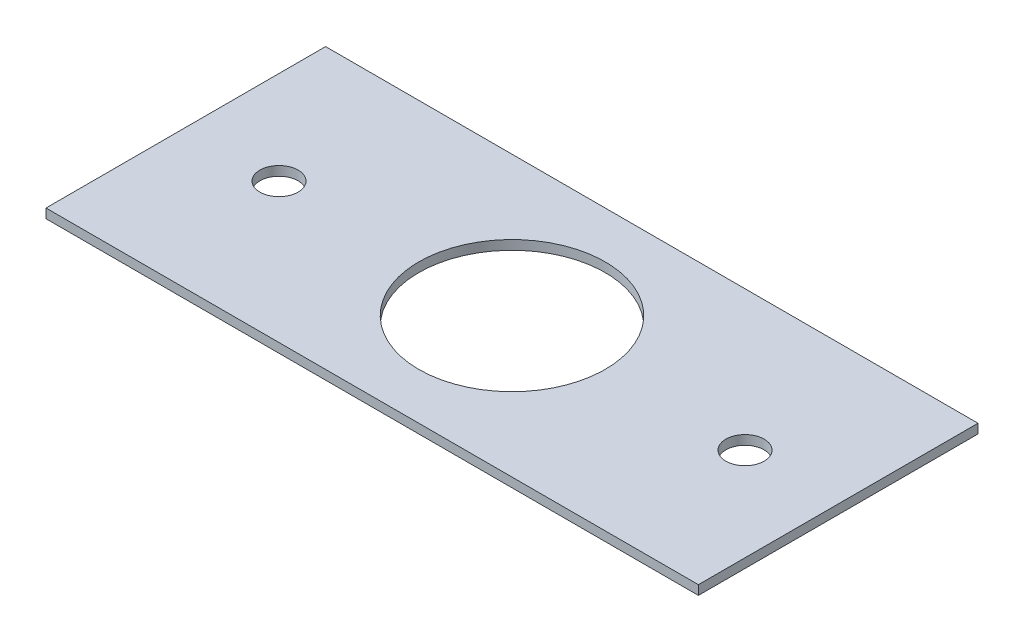
ISO-10303-21;
HEADER;
FILE_DESCRIPTION(('STEP AP214'),'2;1');
FILE_NAME('part.step','',(''),(''),'','','');
FILE_SCHEMA(('AUTOMOTIVE_DESIGN { 1 0 10303 214 1 1 1 1 }'));
ENDSEC;
DATA;
#1=APPLICATION_CONTEXT('core data for automotive mechanical design processes');
#2=APPLICATION_PROTOCOL_DEFINITION('international standard','automotive_design',2000,#1);
#3=PRODUCT_CONTEXT('',#1,'mechanical');
#4=PRODUCT('Part','Part','',(#3));
#5=PRODUCT_RELATED_PRODUCT_CATEGORY('part','',(#4));
#6=PRODUCT_DEFINITION_FORMATION('','',#4);
#7=PRODUCT_DEFINITION_CONTEXT('part definition',#1,'design');
#8=PRODUCT_DEFINITION('design','',#6,#7);
#9=PRODUCT_DEFINITION_SHAPE('','',#8);
#10=(LENGTH_UNIT() NAMED_UNIT(*) SI_UNIT(.MILLI.,.METRE.));
#11=(NAMED_UNIT(*) PLANE_ANGLE_UNIT() SI_UNIT($,.RADIAN.));
#12=(NAMED_UNIT(*) SI_UNIT($,.STERADIAN.) SOLID_ANGLE_UNIT());
#13=UNCERTAINTY_MEASURE_WITH_UNIT(LENGTH_MEASURE(1.E-05),#10,'distance_accuracy_value','');
#14=(GEOMETRIC_REPRESENTATION_CONTEXT(3) GLOBAL_UNCERTAINTY_ASSIGNED_CONTEXT((#13)) GLOBAL_UNIT_ASSIGNED_CONTEXT((#10,
#11,#12)) REPRESENTATION_CONTEXT('',''));
#15=CARTESIAN_POINT('',(0.,0.,0.));
#16=DIRECTION('',(0.,0.,1.));
#17=DIRECTION('',(1.,0.,0.));
#18=AXIS2_PLACEMENT_3D('',#15,#16,#17);
#19=CARTESIAN_POINT('',(0.,1.,0.));
#20=DIRECTION('',(0.,1.,0.));
#21=DIRECTION('',(0.,0.,1.));
#22=AXIS2_PLACEMENT_3D('',#19,#20,#21);
#23=PLANE('',#22);
#24=CARTESIAN_POINT('',(-25.,1.,0.));
#25=DIRECTION('',(0.,1.,0.));
#26=DIRECTION('',(0.,0.,1.));
#27=AXIS2_PLACEMENT_3D('',#24,#25,#26);
#28=CIRCLE('',#27,2.05);
#29=CARTESIAN_POINT('',(-25.,1.,2.05));
#30=VERTEX_POINT('',#29);
#31=EDGE_CURVE('E115',#30,#30,#28,.T.);
#32=ORIENTED_EDGE('',*,*,#31,.F.);
#33=EDGE_LOOP('',(#32));
#34=FACE_BOUND('',#33,.T.);
#35=DIRECTION('',(0.,0.,-1.));
#36=VECTOR('',#35,1.);
#37=CARTESIAN_POINT('',(35.,1.,-15.));
#38=LINE('',#37,#36);
#39=CARTESIAN_POINT('',(35.,1.,15.));
#40=VERTEX_POINT('',#39);
#41=CARTESIAN_POINT('',(35.,1.,-15.));
#42=VERTEX_POINT('',#41);
#43=EDGE_CURVE('E85',#40,#42,#38,.T.);
#44=ORIENTED_EDGE('',*,*,#43,.T.);
#45=DIRECTION('',(-1.,0.,0.));
#46=VECTOR('',#45,1.);
#47=CARTESIAN_POINT('',(-35.,1.,-15.));
#48=LINE('',#47,#46);
#49=CARTESIAN_POINT('',(-35.,1.,-15.));
#50=VERTEX_POINT('',#49);
#51=EDGE_CURVE('E80',#42,#50,#48,.T.);
#52=ORIENTED_EDGE('',*,*,#51,.T.);
#53=DIRECTION('',(0.,0.,1.));
#54=VECTOR('',#53,1.);
#55=CARTESIAN_POINT('',(-35.,1.,-15.));
#56=LINE('',#55,#54);
#57=CARTESIAN_POINT('',(-35.,1.,15.));
#58=VERTEX_POINT('',#57);
#59=EDGE_CURVE('E83',#50,#58,#56,.T.);
#60=ORIENTED_EDGE('',*,*,#59,.T.);
#61=DIRECTION('',(1.,0.,0.));
#62=VECTOR('',#61,1.);
#63=CARTESIAN_POINT('',(-35.,1.,15.));
#64=LINE('',#63,#62);
#65=EDGE_CURVE('E50',#58,#40,#64,.T.);
#66=ORIENTED_EDGE('',*,*,#65,.T.);
#67=EDGE_LOOP('',(#44,#52,#60,#66));
#68=FACE_BOUND('',#67,.T.);
#69=CARTESIAN_POINT('',(0.,1.,0.));
#70=DIRECTION('',(0.,1.,0.));
#71=DIRECTION('',(0.,0.,1.));
#72=AXIS2_PLACEMENT_3D('',#69,#70,#71);
#73=CIRCLE('',#72,10.);
#74=CARTESIAN_POINT('',(0.,1.,10.));
#75=VERTEX_POINT('',#74);
#76=EDGE_CURVE('E100',#75,#75,#73,.T.);
#77=ORIENTED_EDGE('',*,*,#76,.F.);
#78=EDGE_LOOP('',(#77));
#79=FACE_BOUND('',#78,.T.);
#80=CARTESIAN_POINT('',(25.,1.,0.));
#81=DIRECTION('',(0.,1.,0.));
#82=DIRECTION('',(0.,0.,1.));
#83=AXIS2_PLACEMENT_3D('',#80,#81,#82);
#84=CIRCLE('',#83,2.05);
#85=CARTESIAN_POINT('',(25.,1.,2.05));
#86=VERTEX_POINT('',#85);
#87=EDGE_CURVE('E121',#86,#86,#84,.T.);
#88=ORIENTED_EDGE('',*,*,#87,.F.);
#89=EDGE_LOOP('',(#88));
#90=FACE_BOUND('',#89,.T.);
#91=ADVANCED_FACE('F33',(#34,#68,#79,#90),#23,.T.);
#92=CARTESIAN_POINT('',(0.,0.,0.));
#93=DIRECTION('',(0.,1.,0.));
#94=DIRECTION('',(0.,0.,1.));
#95=AXIS2_PLACEMENT_3D('',#92,#93,#94);
#96=PLANE('',#95);
#97=DIRECTION('',(0.,0.,-1.));
#98=VECTOR('',#97,1.);
#99=CARTESIAN_POINT('',(35.,0.,-15.));
#100=LINE('',#99,#98);
#101=CARTESIAN_POINT('',(35.,0.,15.));
#102=VERTEX_POINT('',#101);
#103=CARTESIAN_POINT('',(35.,0.,-15.));
#104=VERTEX_POINT('',#103);
#105=EDGE_CURVE('E97',#102,#104,#100,.T.);
#106=ORIENTED_EDGE('',*,*,#105,.F.);
#107=DIRECTION('',(1.,0.,0.));
#108=VECTOR('',#107,1.);
#109=CARTESIAN_POINT('',(-35.,0.,15.));
#110=LINE('',#109,#108);
#111=CARTESIAN_POINT('',(-35.,0.,15.));
#112=VERTEX_POINT('',#111);
#113=EDGE_CURVE('E73',#112,#102,#110,.T.);
#114=ORIENTED_EDGE('',*,*,#113,.F.);
#115=DIRECTION('',(0.,0.,1.));
#116=VECTOR('',#115,1.);
#117=CARTESIAN_POINT('',(-35.,0.,-15.));
#118=LINE('',#117,#116);
#119=CARTESIAN_POINT('',(-35.,0.,-15.));
#120=VERTEX_POINT('',#119);
#121=EDGE_CURVE('E67',#120,#112,#118,.T.);
#122=ORIENTED_EDGE('',*,*,#121,.F.);
#123=DIRECTION('',(-1.,0.,0.));
#124=VECTOR('',#123,1.);
#125=CARTESIAN_POINT('',(-35.,0.,-15.));
#126=LINE('',#125,#124);
#127=EDGE_CURVE('E89',#104,#120,#126,.T.);
#128=ORIENTED_EDGE('',*,*,#127,.F.);
#129=EDGE_LOOP('',(#106,#114,#122,#128));
#130=FACE_BOUND('',#129,.T.);
#131=CARTESIAN_POINT('',(0.,0.,0.));
#132=DIRECTION('',(0.,1.,0.));
#133=DIRECTION('',(0.,0.,1.));
#134=AXIS2_PLACEMENT_3D('',#131,#132,#133);
#135=CIRCLE('',#134,10.);
#136=CARTESIAN_POINT('',(0.,0.,10.));
#137=VERTEX_POINT('',#136);
#138=EDGE_CURVE('E112',#137,#137,#135,.T.);
#139=ORIENTED_EDGE('',*,*,#138,.T.);
#140=EDGE_LOOP('',(#139));
#141=FACE_BOUND('',#140,.T.);
#142=CARTESIAN_POINT('',(-25.,0.,0.));
#143=DIRECTION('',(0.,1.,0.));
#144=DIRECTION('',(0.,0.,1.));
#145=AXIS2_PLACEMENT_3D('',#142,#143,#144);
#146=CIRCLE('',#145,2.05);
#147=CARTESIAN_POINT('',(-25.,0.,2.05));
#148=VERTEX_POINT('',#147);
#149=EDGE_CURVE('E118',#148,#148,#146,.T.);
#150=ORIENTED_EDGE('',*,*,#149,.T.);
#151=EDGE_LOOP('',(#150));
#152=FACE_BOUND('',#151,.T.);
#153=CARTESIAN_POINT('',(25.,0.,0.));
#154=DIRECTION('',(0.,1.,0.));
#155=DIRECTION('',(0.,0.,1.));
#156=AXIS2_PLACEMENT_3D('',#153,#154,#155);
#157=CIRCLE('',#156,2.05);
#158=CARTESIAN_POINT('',(25.,0.,2.05));
#159=VERTEX_POINT('',#158);
#160=EDGE_CURVE('E124',#159,#159,#157,.T.);
#161=ORIENTED_EDGE('',*,*,#160,.T.);
#162=EDGE_LOOP('',(#161));
#163=FACE_BOUND('',#162,.T.);
#164=ADVANCED_FACE('F108',(#130,#141,#152,#163),#96,.F.);
#165=CARTESIAN_POINT('',(35.,1.,-15.));
#166=DIRECTION('',(-1.,0.,0.));
#167=DIRECTION('',(0.,0.,1.));
#168=AXIS2_PLACEMENT_3D('',#165,#166,#167);
#169=PLANE('',#168);
#170=ORIENTED_EDGE('',*,*,#105,.T.);
#171=DIRECTION('',(0.,-1.,0.));
#172=VECTOR('',#171,1.);
#173=CARTESIAN_POINT('',(35.,1.,-15.));
#174=LINE('',#173,#172);
#175=EDGE_CURVE('E11',#42,#104,#174,.T.);
#176=ORIENTED_EDGE('',*,*,#175,.F.);
#177=ORIENTED_EDGE('',*,*,#43,.F.);
#178=DIRECTION('',(0.,-1.,0.));
#179=VECTOR('',#178,1.);
#180=CARTESIAN_POINT('',(35.,1.,15.));
#181=LINE('',#180,#179);
#182=EDGE_CURVE('E93',#40,#102,#181,.T.);
#183=ORIENTED_EDGE('',*,*,#182,.T.);
#184=EDGE_LOOP('',(#170,#176,#177,#183));
#185=FACE_BOUND('',#184,.T.);
#186=ADVANCED_FACE('F35',(#185),#169,.F.);
#187=CARTESIAN_POINT('',(-35.,1.,-15.));
#188=DIRECTION('',(0.,0.,1.));
#189=DIRECTION('',(1.,0.,0.));
#190=AXIS2_PLACEMENT_3D('',#187,#188,#189);
#191=PLANE('',#190);
#192=ORIENTED_EDGE('',*,*,#127,.T.);
#193=DIRECTION('',(0.,-1.,0.));
#194=VECTOR('',#193,1.);
#195=CARTESIAN_POINT('',(-35.,1.,-15.));
#196=LINE('',#195,#194);
#197=EDGE_CURVE('E42',#50,#120,#196,.T.);
#198=ORIENTED_EDGE('',*,*,#197,.F.);
#199=ORIENTED_EDGE('',*,*,#51,.F.);
#200=ORIENTED_EDGE('',*,*,#175,.T.);
#201=EDGE_LOOP('',(#192,#198,#199,#200));
#202=FACE_BOUND('',#201,.T.);
#203=ADVANCED_FACE('F88',(#202),#191,.F.);
#204=CARTESIAN_POINT('',(-35.,1.,-15.));
#205=DIRECTION('',(1.,0.,0.));
#206=DIRECTION('',(0.,0.,-1.));
#207=AXIS2_PLACEMENT_3D('',#204,#205,#206);
#208=PLANE('',#207);
#209=ORIENTED_EDGE('',*,*,#121,.T.);
#210=DIRECTION('',(0.,-1.,0.));
#211=VECTOR('',#210,1.);
#212=CARTESIAN_POINT('',(-35.,1.,15.));
#213=LINE('',#212,#211);
#214=EDGE_CURVE('E90',#58,#112,#213,.T.);
#215=ORIENTED_EDGE('',*,*,#214,.F.);
#216=ORIENTED_EDGE('',*,*,#59,.F.);
#217=ORIENTED_EDGE('',*,*,#197,.T.);
#218=EDGE_LOOP('',(#209,#215,#216,#217));
#219=FACE_BOUND('',#218,.T.);
#220=ADVANCED_FACE('F91',(#219),#208,.F.);
#221=CARTESIAN_POINT('',(-35.,1.,15.));
#222=DIRECTION('',(0.,0.,-1.));
#223=DIRECTION('',(-1.,0.,0.));
#224=AXIS2_PLACEMENT_3D('',#221,#222,#223);
#225=PLANE('',#224);
#226=ORIENTED_EDGE('',*,*,#113,.T.);
#227=ORIENTED_EDGE('',*,*,#182,.F.);
#228=ORIENTED_EDGE('',*,*,#65,.F.);
#229=ORIENTED_EDGE('',*,*,#214,.T.);
#230=EDGE_LOOP('',(#226,#227,#228,#229));
#231=FACE_BOUND('',#230,.T.);
#232=ADVANCED_FACE('F105',(#231),#225,.F.);
#233=CARTESIAN_POINT('',(0.,1.,0.));
#234=DIRECTION('',(0.,-1.,0.));
#235=DIRECTION('',(0.,0.,-1.));
#236=AXIS2_PLACEMENT_3D('',#233,#234,#235);
#237=CYLINDRICAL_SURFACE('',#236,10.);
#238=ORIENTED_EDGE('',*,*,#76,.T.);
#239=EDGE_LOOP('',(#238));
#240=FACE_BOUND('',#239,.T.);
#241=ORIENTED_EDGE('',*,*,#138,.F.);
#242=EDGE_LOOP('',(#241));
#243=FACE_BOUND('',#242,.T.);
#244=ADVANCED_FACE('F142',(#240,#243),#237,.F.);
#245=CARTESIAN_POINT('',(-25.,1.,0.));
#246=DIRECTION('',(0.,-1.,0.));
#247=DIRECTION('',(0.,0.,-1.));
#248=AXIS2_PLACEMENT_3D('',#245,#246,#247);
#249=CYLINDRICAL_SURFACE('',#248,2.05);
#250=ORIENTED_EDGE('',*,*,#31,.T.);
#251=EDGE_LOOP('',(#250));
#252=FACE_BOUND('',#251,.T.);
#253=ORIENTED_EDGE('',*,*,#149,.F.);
#254=EDGE_LOOP('',(#253));
#255=FACE_BOUND('',#254,.T.);
#256=ADVANCED_FACE('F188',(#252,#255),#249,.F.);
#257=CARTESIAN_POINT('',(25.,1.,0.));
#258=DIRECTION('',(0.,-1.,0.));
#259=DIRECTION('',(0.,0.,-1.));
#260=AXIS2_PLACEMENT_3D('',#257,#258,#259);
#261=CYLINDRICAL_SURFACE('',#260,2.05);
#262=ORIENTED_EDGE('',*,*,#87,.T.);
#263=EDGE_LOOP('',(#262));
#264=FACE_BOUND('',#263,.T.);
#265=ORIENTED_EDGE('',*,*,#160,.F.);
#266=EDGE_LOOP('',(#265));
#267=FACE_BOUND('',#266,.T.);
#268=ADVANCED_FACE('F130',(#264,#267),#261,.F.);
#269=CLOSED_SHELL('',(#91,#164,#186,#203,#220,#232,#244,#256,#268));
#270=MANIFOLD_SOLID_BREP('B2',#269);
#271=ADVANCED_BREP_SHAPE_REPRESENTATION('',(#18,#270),#14);
#272=SHAPE_DEFINITION_REPRESENTATION(#9,#271);
ENDSEC;
END-ISO-10303-21;
